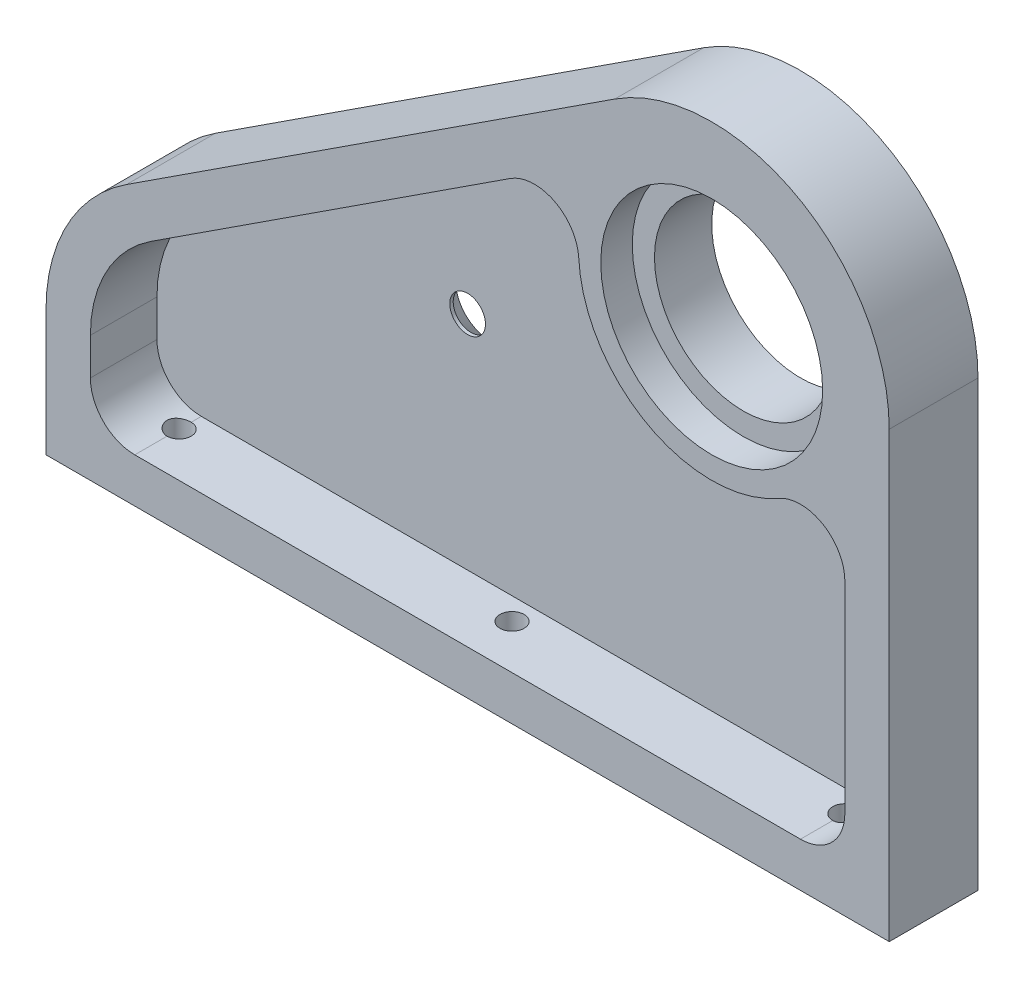
ISO-10303-21;
HEADER;
FILE_DESCRIPTION(('STEP AP214'),'2;1');
FILE_NAME('part.step','',(''),(''),'','','');
FILE_SCHEMA(('AUTOMOTIVE_DESIGN { 1 0 10303 214 1 1 1 1 }'));
ENDSEC;
DATA;
#1=APPLICATION_CONTEXT('core data for automotive mechanical design processes');
#2=APPLICATION_PROTOCOL_DEFINITION('international standard','automotive_design',2000,#1);
#3=PRODUCT_CONTEXT('',#1,'mechanical');
#4=PRODUCT('Part','Part','',(#3));
#5=PRODUCT_RELATED_PRODUCT_CATEGORY('part','',(#4));
#6=PRODUCT_DEFINITION_FORMATION('','',#4);
#7=PRODUCT_DEFINITION_CONTEXT('part definition',#1,'design');
#8=PRODUCT_DEFINITION('design','',#6,#7);
#9=PRODUCT_DEFINITION_SHAPE('','',#8);
#10=(LENGTH_UNIT() NAMED_UNIT(*) SI_UNIT(.MILLI.,.METRE.));
#11=(NAMED_UNIT(*) PLANE_ANGLE_UNIT() SI_UNIT($,.RADIAN.));
#12=(NAMED_UNIT(*) SI_UNIT($,.STERADIAN.) SOLID_ANGLE_UNIT());
#13=UNCERTAINTY_MEASURE_WITH_UNIT(LENGTH_MEASURE(1.E-05),#10,'distance_accuracy_value','');
#14=(GEOMETRIC_REPRESENTATION_CONTEXT(3) GLOBAL_UNCERTAINTY_ASSIGNED_CONTEXT((#13)) GLOBAL_UNIT_ASSIGNED_CONTEXT((#10,
#11,#12)) REPRESENTATION_CONTEXT('',''));
#15=CARTESIAN_POINT('',(0.,0.,0.));
#16=DIRECTION('',(0.,0.,1.));
#17=DIRECTION('',(1.,0.,0.));
#18=AXIS2_PLACEMENT_3D('',#15,#16,#17);
#19=CARTESIAN_POINT('',(0.,0.,6.35));
#20=DIRECTION('',(0.,0.,1.));
#21=DIRECTION('',(1.,0.,0.));
#22=AXIS2_PLACEMENT_3D('',#19,#20,#21);
#23=PLANE('',#22);
#24=CARTESIAN_POINT('',(0.,0.,6.35));
#25=DIRECTION('',(0.,0.,-1.));
#26=DIRECTION('',(1.,0.,0.));
#27=AXIS2_PLACEMENT_3D('',#24,#25,#26);
#28=CIRCLE('',#27,19.05);
#29=CARTESIAN_POINT('',(9.525,-16.4977839420936,6.35));
#30=VERTEX_POINT('',#29);
#31=CARTESIAN_POINT('',(-19.0223209419699,-1.026550525154,6.35));
#32=VERTEX_POINT('',#31);
#33=EDGE_CURVE('E337',#30,#32,#28,.T.);
#34=ORIENTED_EDGE('',*,*,#33,.F.);
#35=CARTESIAN_POINT('',(12.7,-21.9970452561247,6.34999999999999));
#36=DIRECTION('',(0.,0.,1.));
#37=DIRECTION('',(1.,0.,0.));
#38=AXIS2_PLACEMENT_3D('',#35,#36,#37);
#39=CIRCLE('',#38,6.35);
#40=CARTESIAN_POINT('',(19.05,-21.9970452561247,6.35));
#41=VERTEX_POINT('',#40);
#42=EDGE_CURVE('E210',#30,#41,#39,.F.);
#43=ORIENTED_EDGE('',*,*,#42,.T.);
#44=DIRECTION('',(0.,1.,0.));
#45=VECTOR('',#44,1.);
#46=CARTESIAN_POINT('',(19.05,-57.15,6.35));
#47=LINE('',#46,#45);
#48=CARTESIAN_POINT('',(19.05,-50.8,6.35));
#49=VERTEX_POINT('',#48);
#50=EDGE_CURVE('E364',#49,#41,#47,.T.);
#51=ORIENTED_EDGE('',*,*,#50,.F.);
#52=CARTESIAN_POINT('',(12.7,-50.8,6.34999999999999));
#53=DIRECTION('',(0.,0.,1.));
#54=DIRECTION('',(1.,0.,0.));
#55=AXIS2_PLACEMENT_3D('',#52,#53,#54);
#56=CIRCLE('',#55,6.35);
#57=CARTESIAN_POINT('',(12.7,-57.15,6.35));
#58=VERTEX_POINT('',#57);
#59=EDGE_CURVE('E208',#49,#58,#56,.F.);
#60=ORIENTED_EDGE('',*,*,#59,.T.);
#61=DIRECTION('',(1.,0.,0.));
#62=VECTOR('',#61,1.);
#63=CARTESIAN_POINT('',(-88.9,-57.15,6.35));
#64=LINE('',#63,#62);
#65=CARTESIAN_POINT('',(-82.55,-57.15,6.35));
#66=VERTEX_POINT('',#65);
#67=EDGE_CURVE('E362',#66,#58,#64,.T.);
#68=ORIENTED_EDGE('',*,*,#67,.F.);
#69=CARTESIAN_POINT('',(-82.55,-50.8,6.34999999999999));
#70=DIRECTION('',(0.,0.,1.));
#71=DIRECTION('',(1.,0.,0.));
#72=AXIS2_PLACEMENT_3D('',#69,#70,#71);
#73=CIRCLE('',#72,6.35);
#74=CARTESIAN_POINT('',(-88.9,-50.8,6.35));
#75=VERTEX_POINT('',#74);
#76=EDGE_CURVE('E175',#66,#75,#73,.F.);
#77=ORIENTED_EDGE('',*,*,#76,.T.);
#78=DIRECTION('',(0.,-1.,0.));
#79=VECTOR('',#78,1.);
#80=CARTESIAN_POINT('',(-88.9,-45.5155414176721,6.35));
#81=LINE('',#80,#79);
#82=CARTESIAN_POINT('',(-88.9,-45.5155414176721,6.35));
#83=VERTEX_POINT('',#82);
#84=EDGE_CURVE('E359',#83,#75,#81,.T.);
#85=ORIENTED_EDGE('',*,*,#84,.F.);
#86=CARTESIAN_POINT('',(-69.85,-45.5155414176721,6.35));
#87=DIRECTION('',(0.,0.,1.));
#88=DIRECTION('',(1.,0.,0.));
#89=AXIS2_PLACEMENT_3D('',#86,#87,#88);
#90=CIRCLE('',#89,19.05);
#91=CARTESIAN_POINT('',(-80.2501793040366,-29.5550035055625,6.35));
#92=VERTEX_POINT('',#91);
#93=EDGE_CURVE('E356',#92,#83,#90,.T.);
#94=ORIENTED_EDGE('',*,*,#93,.F.);
#95=DIRECTION('',(-0.837823512446701,-0.545941170815567,0.));
#96=VECTOR('',#95,1.);
#97=CARTESIAN_POINT('',(-10.4001793040365,15.9605379121096,6.35));
#98=LINE('',#97,#96);
#99=CARTESIAN_POINT('',(-28.829821023972,3.95144527049789,6.35));
#100=VERTEX_POINT('',#99);
#101=EDGE_CURVE('E354',#100,#92,#98,.T.);
#102=ORIENTED_EDGE('',*,*,#101,.F.);
#103=CARTESIAN_POINT('',(-25.3630945892932,-1.36873403353867,6.34999999999999));
#104=DIRECTION('',(0.,0.,1.));
#105=DIRECTION('',(1.,0.,0.));
#106=AXIS2_PLACEMENT_3D('',#103,#104,#105);
#107=CIRCLE('',#106,6.35);
#108=EDGE_CURVE('E212',#100,#32,#107,.F.);
#109=ORIENTED_EDGE('',*,*,#108,.T.);
#110=EDGE_LOOP('',(#34,#43,#51,#60,#68,#77,#85,#94,#102,#109));
#111=FACE_BOUND('',#110,.T.);
#112=DIRECTION('',(-0.837823512446701,-0.545941170815567,0.));
#113=VECTOR('',#112,1.);
#114=CARTESIAN_POINT('',(-13.8669057387154,21.2807172161462,6.35));
#115=LINE('',#114,#113);
#116=CARTESIAN_POINT('',(-13.8669057387154,21.2807172161462,6.35));
#117=VERTEX_POINT('',#116);
#118=CARTESIAN_POINT('',(-83.7169057387154,-24.2348242015259,6.35));
#119=VERTEX_POINT('',#118);
#120=EDGE_CURVE('E387',#117,#119,#115,.T.);
#121=ORIENTED_EDGE('',*,*,#120,.T.);
#122=CARTESIAN_POINT('',(-69.85,-45.5155414176721,6.35));
#123=DIRECTION('',(0.,0.,1.));
#124=DIRECTION('',(1.,0.,0.));
#125=AXIS2_PLACEMENT_3D('',#122,#123,#124);
#126=CIRCLE('',#125,25.4);
#127=CARTESIAN_POINT('',(-95.25,-45.5155414176721,6.35));
#128=VERTEX_POINT('',#127);
#129=EDGE_CURVE('E427',#119,#128,#126,.T.);
#130=ORIENTED_EDGE('',*,*,#129,.T.);
#131=DIRECTION('',(0.,-1.,0.));
#132=VECTOR('',#131,1.);
#133=CARTESIAN_POINT('',(-95.25,-63.5,6.35));
#134=LINE('',#133,#132);
#135=CARTESIAN_POINT('',(-95.25,-63.5,6.35));
#136=VERTEX_POINT('',#135);
#137=EDGE_CURVE('E391',#128,#136,#134,.T.);
#138=ORIENTED_EDGE('',*,*,#137,.T.);
#139=DIRECTION('',(1.,0.,0.));
#140=VECTOR('',#139,1.);
#141=CARTESIAN_POINT('',(25.4,-63.5,6.35));
#142=LINE('',#141,#140);
#143=CARTESIAN_POINT('',(25.4,-63.5,6.35));
#144=VERTEX_POINT('',#143);
#145=EDGE_CURVE('E393',#136,#144,#142,.T.);
#146=ORIENTED_EDGE('',*,*,#145,.T.);
#147=DIRECTION('',(0.,1.,0.));
#148=VECTOR('',#147,1.);
#149=CARTESIAN_POINT('',(25.4,0.,6.35));
#150=LINE('',#149,#148);
#151=CARTESIAN_POINT('',(25.4,0.,6.35));
#152=VERTEX_POINT('',#151);
#153=EDGE_CURVE('E395',#144,#152,#150,.T.);
#154=ORIENTED_EDGE('',*,*,#153,.T.);
#155=CARTESIAN_POINT('',(0.,0.,6.35));
#156=DIRECTION('',(0.,0.,1.));
#157=DIRECTION('',(1.,0.,0.));
#158=AXIS2_PLACEMENT_3D('',#155,#156,#157);
#159=CIRCLE('',#158,25.4);
#160=EDGE_CURVE('E384',#152,#117,#159,.T.);
#161=ORIENTED_EDGE('',*,*,#160,.T.);
#162=EDGE_LOOP('',(#121,#130,#138,#146,#154,#161));
#163=FACE_BOUND('',#162,.T.);
#164=CARTESIAN_POINT('',(0.,0.,6.35));
#165=DIRECTION('',(0.,0.,-1.));
#166=DIRECTION('',(-1.,0.,0.));
#167=AXIS2_PLACEMENT_3D('',#164,#165,#166);
#168=CIRCLE('',#167,15.875);
#169=CARTESIAN_POINT('',(-15.875,0.,6.35));
#170=VERTEX_POINT('',#169);
#171=EDGE_CURVE('E373',#170,#170,#168,.T.);
#172=ORIENTED_EDGE('',*,*,#171,.T.);
#173=EDGE_LOOP('',(#172));
#174=FACE_BOUND('',#173,.T.);
#175=ADVANCED_FACE('F36',(#111,#163,#174),#23,.T.);
#176=CARTESIAN_POINT('',(0.,0.,6.35));
#177=DIRECTION('',(0.,0.,-1.));
#178=DIRECTION('',(-1.,0.,0.));
#179=AXIS2_PLACEMENT_3D('',#176,#177,#178);
#180=CYLINDRICAL_SURFACE('',#179,25.4);
#181=CARTESIAN_POINT('',(0.,0.,-6.35));
#182=DIRECTION('',(0.,0.,1.));
#183=DIRECTION('',(1.,0.,0.));
#184=AXIS2_PLACEMENT_3D('',#181,#182,#183);
#185=CIRCLE('',#184,25.4);
#186=CARTESIAN_POINT('',(25.4,0.,-6.35));
#187=VERTEX_POINT('',#186);
#188=CARTESIAN_POINT('',(-13.8669057387154,21.2807172161462,-6.35));
#189=VERTEX_POINT('',#188);
#190=EDGE_CURVE('E383',#187,#189,#185,.T.);
#191=ORIENTED_EDGE('',*,*,#190,.T.);
#192=DIRECTION('',(0.,0.,-1.));
#193=VECTOR('',#192,1.);
#194=CARTESIAN_POINT('',(-13.8669057387154,21.2807172161462,6.35));
#195=LINE('',#194,#193);
#196=EDGE_CURVE('E416',#117,#189,#195,.T.);
#197=ORIENTED_EDGE('',*,*,#196,.F.);
#198=ORIENTED_EDGE('',*,*,#160,.F.);
#199=DIRECTION('',(0.,0.,-1.));
#200=VECTOR('',#199,1.);
#201=CARTESIAN_POINT('',(25.4,0.,6.35));
#202=LINE('',#201,#200);
#203=EDGE_CURVE('E397',#152,#187,#202,.T.);
#204=ORIENTED_EDGE('',*,*,#203,.T.);
#205=EDGE_LOOP('',(#191,#197,#198,#204));
#206=FACE_BOUND('',#205,.T.);
#207=ADVANCED_FACE('F275',(#206),#180,.T.);
#208=CARTESIAN_POINT('',(-13.8669057387154,21.2807172161462,6.35));
#209=DIRECTION('',(0.545941170815567,-0.837823512446701,0.));
#210=DIRECTION('',(0.837823512446701,0.545941170815567,0.));
#211=AXIS2_PLACEMENT_3D('',#208,#209,#210);
#212=PLANE('',#211);
#213=DIRECTION('',(-0.837823512446701,-0.545941170815567,0.));
#214=VECTOR('',#213,1.);
#215=CARTESIAN_POINT('',(-13.8669057387154,21.2807172161462,-6.35));
#216=LINE('',#215,#214);
#217=CARTESIAN_POINT('',(-83.7169057387154,-24.2348242015259,-6.35));
#218=VERTEX_POINT('',#217);
#219=EDGE_CURVE('E400',#189,#218,#216,.T.);
#220=ORIENTED_EDGE('',*,*,#219,.T.);
#221=DIRECTION('',(0.,0.,-1.));
#222=VECTOR('',#221,1.);
#223=CARTESIAN_POINT('',(-83.7169057387154,-24.2348242015259,6.35));
#224=LINE('',#223,#222);
#225=EDGE_CURVE('E426',#218,#119,#224,.F.);
#226=ORIENTED_EDGE('',*,*,#225,.T.);
#227=ORIENTED_EDGE('',*,*,#120,.F.);
#228=ORIENTED_EDGE('',*,*,#196,.T.);
#229=EDGE_LOOP('',(#220,#226,#227,#228));
#230=FACE_BOUND('',#229,.T.);
#231=ADVANCED_FACE('F291',(#230),#212,.F.);
#232=CARTESIAN_POINT('',(-95.25,-63.5,6.35));
#233=DIRECTION('',(1.,0.,0.));
#234=DIRECTION('',(0.,1.,0.));
#235=AXIS2_PLACEMENT_3D('',#232,#233,#234);
#236=PLANE('',#235);
#237=ORIENTED_EDGE('',*,*,#137,.F.);
#238=DIRECTION('',(0.,0.,-1.));
#239=VECTOR('',#238,1.);
#240=CARTESIAN_POINT('',(-95.25,-45.5155414176721,6.35));
#241=LINE('',#240,#239);
#242=CARTESIAN_POINT('',(-95.25,-45.5155414176721,-6.35));
#243=VERTEX_POINT('',#242);
#244=EDGE_CURVE('E419',#128,#243,#241,.T.);
#245=ORIENTED_EDGE('',*,*,#244,.T.);
#246=DIRECTION('',(0.,-1.,0.));
#247=VECTOR('',#246,1.);
#248=CARTESIAN_POINT('',(-95.25,-63.5,-6.35));
#249=LINE('',#248,#247);
#250=CARTESIAN_POINT('',(-95.25,-63.5,-6.35));
#251=VERTEX_POINT('',#250);
#252=EDGE_CURVE('E403',#243,#251,#249,.T.);
#253=ORIENTED_EDGE('',*,*,#252,.T.);
#254=DIRECTION('',(0.,0.,-1.));
#255=VECTOR('',#254,1.);
#256=CARTESIAN_POINT('',(-95.25,-63.5,6.35));
#257=LINE('',#256,#255);
#258=EDGE_CURVE('E413',#136,#251,#257,.T.);
#259=ORIENTED_EDGE('',*,*,#258,.F.);
#260=EDGE_LOOP('',(#237,#245,#253,#259));
#261=FACE_BOUND('',#260,.T.);
#262=ADVANCED_FACE('F287',(#261),#236,.F.);
#263=CARTESIAN_POINT('',(25.4,-63.5,6.35));
#264=DIRECTION('',(0.,1.,0.));
#265=DIRECTION('',(0.,0.,1.));
#266=AXIS2_PLACEMENT_3D('',#263,#264,#265);
#267=PLANE('',#266);
#268=CARTESIAN_POINT('',(-82.55,-63.5,0.));
#269=DIRECTION('',(0.,-1.,0.));
#270=DIRECTION('',(0.,0.,-1.));
#271=AXIS2_PLACEMENT_3D('',#268,#269,#270);
#272=CIRCLE('',#271,1.7272);
#273=CARTESIAN_POINT('',(-82.55,-63.5,-1.72720000000001));
#274=VERTEX_POINT('',#273);
#275=EDGE_CURVE('E171',#274,#274,#272,.T.);
#276=ORIENTED_EDGE('',*,*,#275,.F.);
#277=EDGE_LOOP('',(#276));
#278=FACE_BOUND('',#277,.T.);
#279=CARTESIAN_POINT('',(-34.925,-63.5,0.));
#280=DIRECTION('',(0.,-1.,0.));
#281=DIRECTION('',(0.,0.,-1.));
#282=AXIS2_PLACEMENT_3D('',#279,#280,#281);
#283=CIRCLE('',#282,1.7272);
#284=CARTESIAN_POINT('',(-34.925,-63.5,-1.7272));
#285=VERTEX_POINT('',#284);
#286=EDGE_CURVE('E170',#285,#285,#283,.T.);
#287=ORIENTED_EDGE('',*,*,#286,.F.);
#288=EDGE_LOOP('',(#287));
#289=FACE_BOUND('',#288,.T.);
#290=CARTESIAN_POINT('',(12.7,-63.5,0.));
#291=DIRECTION('',(0.,-1.,0.));
#292=DIRECTION('',(0.,0.,-1.));
#293=AXIS2_PLACEMENT_3D('',#290,#291,#292);
#294=CIRCLE('',#293,1.7272);
#295=CARTESIAN_POINT('',(12.7,-63.5,-1.7272));
#296=VERTEX_POINT('',#295);
#297=EDGE_CURVE('E333',#296,#296,#294,.T.);
#298=ORIENTED_EDGE('',*,*,#297,.F.);
#299=EDGE_LOOP('',(#298));
#300=FACE_BOUND('',#299,.T.);
#301=DIRECTION('',(1.,0.,0.));
#302=VECTOR('',#301,1.);
#303=CARTESIAN_POINT('',(25.4,-63.5,-6.35));
#304=LINE('',#303,#302);
#305=CARTESIAN_POINT('',(25.4,-63.5,-6.35));
#306=VERTEX_POINT('',#305);
#307=EDGE_CURVE('E405',#251,#306,#304,.T.);
#308=ORIENTED_EDGE('',*,*,#307,.T.);
#309=DIRECTION('',(0.,0.,-1.));
#310=VECTOR('',#309,1.);
#311=CARTESIAN_POINT('',(25.4,-63.5,6.35));
#312=LINE('',#311,#310);
#313=EDGE_CURVE('E410',#144,#306,#312,.T.);
#314=ORIENTED_EDGE('',*,*,#313,.F.);
#315=ORIENTED_EDGE('',*,*,#145,.F.);
#316=ORIENTED_EDGE('',*,*,#258,.T.);
#317=EDGE_LOOP('',(#308,#314,#315,#316));
#318=FACE_BOUND('',#317,.T.);
#319=ADVANCED_FACE('F283',(#278,#289,#300,#318),#267,.F.);
#320=CARTESIAN_POINT('',(25.4,0.,6.35));
#321=DIRECTION('',(-1.,0.,0.));
#322=DIRECTION('',(0.,-1.,0.));
#323=AXIS2_PLACEMENT_3D('',#320,#321,#322);
#324=PLANE('',#323);
#325=DIRECTION('',(0.,1.,0.));
#326=VECTOR('',#325,1.);
#327=CARTESIAN_POINT('',(25.4,0.,-6.35));
#328=LINE('',#327,#326);
#329=EDGE_CURVE('E388',#306,#187,#328,.T.);
#330=ORIENTED_EDGE('',*,*,#329,.T.);
#331=ORIENTED_EDGE('',*,*,#203,.F.);
#332=ORIENTED_EDGE('',*,*,#153,.F.);
#333=ORIENTED_EDGE('',*,*,#313,.T.);
#334=EDGE_LOOP('',(#330,#331,#332,#333));
#335=FACE_BOUND('',#334,.T.);
#336=ADVANCED_FACE('F279',(#335),#324,.F.);
#337=CARTESIAN_POINT('',(0.,0.,-6.35));
#338=DIRECTION('',(0.,0.,1.));
#339=DIRECTION('',(1.,0.,0.));
#340=AXIS2_PLACEMENT_3D('',#337,#338,#339);
#341=PLANE('',#340);
#342=CARTESIAN_POINT('',(-44.45,-25.4,-6.35));
#343=DIRECTION('',(0.,0.,-1.));
#344=DIRECTION('',(-1.,0.,0.));
#345=AXIS2_PLACEMENT_3D('',#342,#343,#344);
#346=CIRCLE('',#345,4.8895);
#347=CARTESIAN_POINT('',(-49.3395,-25.4,-6.35));
#348=VERTEX_POINT('',#347);
#349=EDGE_CURVE('E325',#348,#348,#346,.T.);
#350=ORIENTED_EDGE('',*,*,#349,.F.);
#351=EDGE_LOOP('',(#350));
#352=FACE_BOUND('',#351,.T.);
#353=CARTESIAN_POINT('',(0.,0.,-6.35));
#354=DIRECTION('',(0.,0.,1.));
#355=DIRECTION('',(1.,0.,0.));
#356=AXIS2_PLACEMENT_3D('',#353,#354,#355);
#357=CIRCLE('',#356,12.7);
#358=CARTESIAN_POINT('',(12.7,0.,-6.35));
#359=VERTEX_POINT('',#358);
#360=EDGE_CURVE('E380',#359,#359,#357,.T.);
#361=ORIENTED_EDGE('',*,*,#360,.T.);
#362=EDGE_LOOP('',(#361));
#363=FACE_BOUND('',#362,.T.);
#364=ORIENTED_EDGE('',*,*,#252,.F.);
#365=CARTESIAN_POINT('',(-69.85,-45.5155414176721,-6.35));
#366=DIRECTION('',(0.,0.,1.));
#367=DIRECTION('',(1.,0.,0.));
#368=AXIS2_PLACEMENT_3D('',#365,#366,#367);
#369=CIRCLE('',#368,25.4);
#370=EDGE_CURVE('E424',#243,#218,#369,.F.);
#371=ORIENTED_EDGE('',*,*,#370,.T.);
#372=ORIENTED_EDGE('',*,*,#219,.F.);
#373=ORIENTED_EDGE('',*,*,#190,.F.);
#374=ORIENTED_EDGE('',*,*,#329,.F.);
#375=ORIENTED_EDGE('',*,*,#307,.F.);
#376=EDGE_LOOP('',(#364,#371,#372,#373,#374,#375));
#377=FACE_BOUND('',#376,.T.);
#378=ADVANCED_FACE('F271',(#352,#363,#377),#341,.F.);
#379=CARTESIAN_POINT('',(0.,0.,-6.35));
#380=DIRECTION('',(0.,0.,1.));
#381=DIRECTION('',(1.,0.,0.));
#382=AXIS2_PLACEMENT_3D('',#379,#380,#381);
#383=CYLINDRICAL_SURFACE('',#382,12.7);
#384=CARTESIAN_POINT('',(0.,0.,1.8415));
#385=DIRECTION('',(0.,0.,-1.));
#386=DIRECTION('',(-1.,0.,0.));
#387=AXIS2_PLACEMENT_3D('',#384,#385,#386);
#388=CIRCLE('',#387,12.7);
#389=CARTESIAN_POINT('',(-12.7,0.,1.8415));
#390=VERTEX_POINT('',#389);
#391=EDGE_CURVE('E377',#390,#390,#388,.F.);
#392=ORIENTED_EDGE('',*,*,#391,.T.);
#393=EDGE_LOOP('',(#392));
#394=FACE_BOUND('',#393,.T.);
#395=ORIENTED_EDGE('',*,*,#360,.F.);
#396=EDGE_LOOP('',(#395));
#397=FACE_BOUND('',#396,.T.);
#398=ADVANCED_FACE('F264',(#394,#397),#383,.F.);
#399=CARTESIAN_POINT('',(0.,0.,1.8415));
#400=DIRECTION('',(0.,0.,-1.));
#401=DIRECTION('',(-1.,0.,0.));
#402=AXIS2_PLACEMENT_3D('',#399,#400,#401);
#403=PLANE('',#402);
#404=CARTESIAN_POINT('',(0.,0.,1.8415));
#405=DIRECTION('',(0.,0.,-1.));
#406=DIRECTION('',(-1.,0.,0.));
#407=AXIS2_PLACEMENT_3D('',#404,#405,#406);
#408=CIRCLE('',#407,15.875);
#409=CARTESIAN_POINT('',(-15.875,0.,1.8415));
#410=VERTEX_POINT('',#409);
#411=EDGE_CURVE('E374',#410,#410,#408,.T.);
#412=ORIENTED_EDGE('',*,*,#411,.F.);
#413=EDGE_LOOP('',(#412));
#414=FACE_BOUND('',#413,.T.);
#415=ORIENTED_EDGE('',*,*,#391,.F.);
#416=EDGE_LOOP('',(#415));
#417=FACE_BOUND('',#416,.T.);
#418=ADVANCED_FACE('F260',(#414,#417),#403,.F.);
#419=CARTESIAN_POINT('',(0.,0.,1.8415));
#420=DIRECTION('',(0.,0.,1.));
#421=DIRECTION('',(1.,0.,0.));
#422=AXIS2_PLACEMENT_3D('',#419,#420,#421);
#423=CYLINDRICAL_SURFACE('',#422,15.875);
#424=ORIENTED_EDGE('',*,*,#411,.T.);
#425=EDGE_LOOP('',(#424));
#426=FACE_BOUND('',#425,.T.);
#427=ORIENTED_EDGE('',*,*,#171,.F.);
#428=EDGE_LOOP('',(#427));
#429=FACE_BOUND('',#428,.T.);
#430=ADVANCED_FACE('F263',(#426,#429),#423,.F.);
#431=CARTESIAN_POINT('',(-69.85,-45.5155414176721,6.35));
#432=DIRECTION('',(0.,0.,-1.));
#433=DIRECTION('',(-1.,0.,0.));
#434=AXIS2_PLACEMENT_3D('',#431,#432,#433);
#435=CYLINDRICAL_SURFACE('',#434,25.4);
#436=ORIENTED_EDGE('',*,*,#129,.F.);
#437=ORIENTED_EDGE('',*,*,#225,.F.);
#438=ORIENTED_EDGE('',*,*,#370,.F.);
#439=ORIENTED_EDGE('',*,*,#244,.F.);
#440=EDGE_LOOP('',(#436,#437,#438,#439));
#441=FACE_BOUND('',#440,.T.);
#442=ADVANCED_FACE('F258',(#441),#435,.T.);
#443=CARTESIAN_POINT('',(0.,0.,-136.727732967704));
#444=DIRECTION('',(0.,0.,1.));
#445=DIRECTION('',(1.,0.,0.));
#446=AXIS2_PLACEMENT_3D('',#443,#444,#445);
#447=CYLINDRICAL_SURFACE('',#446,19.05);
#448=CARTESIAN_POINT('',(0.,0.,-3.17500000000001));
#449=DIRECTION('',(0.,0.,1.));
#450=DIRECTION('',(1.,0.,0.));
#451=AXIS2_PLACEMENT_3D('',#448,#449,#450);
#452=CIRCLE('',#451,19.05);
#453=CARTESIAN_POINT('',(-19.0223209419699,-1.026550525154,-3.17500000000001));
#454=VERTEX_POINT('',#453);
#455=CARTESIAN_POINT('',(9.525,-16.4977839420936,-3.17500000000001));
#456=VERTEX_POINT('',#455);
#457=EDGE_CURVE('E348',#454,#456,#452,.T.);
#458=ORIENTED_EDGE('',*,*,#457,.T.);
#459=DIRECTION('',(0.,0.,1.));
#460=VECTOR('',#459,1.);
#461=CARTESIAN_POINT('',(9.525,-16.4977839420936,-136.727732967704));
#462=LINE('',#461,#460);
#463=EDGE_CURVE('E201',#456,#30,#462,.T.);
#464=ORIENTED_EDGE('',*,*,#463,.T.);
#465=ORIENTED_EDGE('',*,*,#33,.T.);
#466=DIRECTION('',(0.,0.,1.));
#467=VECTOR('',#466,1.);
#468=CARTESIAN_POINT('',(-19.0223209419699,-1.026550525154,-136.727732967704));
#469=LINE('',#468,#467);
#470=EDGE_CURVE('E199',#32,#454,#469,.F.);
#471=ORIENTED_EDGE('',*,*,#470,.T.);
#472=EDGE_LOOP('',(#458,#464,#465,#471));
#473=FACE_BOUND('',#472,.T.);
#474=ADVANCED_FACE('F240',(#473),#447,.T.);
#475=CARTESIAN_POINT('',(19.05,-57.15,-136.727732967704));
#476=DIRECTION('',(1.,0.,0.));
#477=DIRECTION('',(0.,0.,-1.));
#478=AXIS2_PLACEMENT_3D('',#475,#476,#477);
#479=PLANE('',#478);
#480=DIRECTION('',(0.,-1.,0.));
#481=VECTOR('',#480,1.);
#482=CARTESIAN_POINT('',(19.05,-57.15,-3.17500000000001));
#483=LINE('',#482,#481);
#484=CARTESIAN_POINT('',(19.05,-21.9970452561247,-3.17500000000001));
#485=VERTEX_POINT('',#484);
#486=CARTESIAN_POINT('',(19.05,-50.8,-3.17500000000001));
#487=VERTEX_POINT('',#486);
#488=EDGE_CURVE('E345',#485,#487,#483,.T.);
#489=ORIENTED_EDGE('',*,*,#488,.T.);
#490=DIRECTION('',(0.,0.,1.));
#491=VECTOR('',#490,1.);
#492=CARTESIAN_POINT('',(19.05,-50.8,6.34999999999999));
#493=LINE('',#492,#491);
#494=EDGE_CURVE('E196',#487,#49,#493,.T.);
#495=ORIENTED_EDGE('',*,*,#494,.T.);
#496=ORIENTED_EDGE('',*,*,#50,.T.);
#497=DIRECTION('',(0.,0.,-1.));
#498=VECTOR('',#497,1.);
#499=CARTESIAN_POINT('',(19.05,-21.9970452561247,-3.17500000000001));
#500=LINE('',#499,#498);
#501=EDGE_CURVE('E194',#41,#485,#500,.T.);
#502=ORIENTED_EDGE('',*,*,#501,.T.);
#503=EDGE_LOOP('',(#489,#495,#496,#502));
#504=FACE_BOUND('',#503,.T.);
#505=ADVANCED_FACE('F237',(#504),#479,.F.);
#506=CARTESIAN_POINT('',(-88.9,-57.15,-136.727732967704));
#507=DIRECTION('',(0.,-1.,0.));
#508=DIRECTION('',(0.,0.,-1.));
#509=AXIS2_PLACEMENT_3D('',#506,#507,#508);
#510=PLANE('',#509);
#511=CARTESIAN_POINT('',(-34.925,-57.15,0.));
#512=DIRECTION('',(0.,-1.,0.));
#513=DIRECTION('',(0.,0.,-1.));
#514=AXIS2_PLACEMENT_3D('',#511,#512,#513);
#515=CIRCLE('',#514,1.7272);
#516=CARTESIAN_POINT('',(-34.925,-57.15,-1.7272));
#517=VERTEX_POINT('',#516);
#518=EDGE_CURVE('E220',#517,#517,#515,.T.);
#519=ORIENTED_EDGE('',*,*,#518,.T.);
#520=EDGE_LOOP('',(#519));
#521=FACE_BOUND('',#520,.T.);
#522=DIRECTION('',(0.,0.,1.));
#523=VECTOR('',#522,1.);
#524=CARTESIAN_POINT('',(-82.55,-57.15,6.34999999999999));
#525=LINE('',#524,#523);
#526=CARTESIAN_POINT('',(-82.55,-57.15,-3.17500000000001));
#527=VERTEX_POINT('',#526);
#528=CARTESIAN_POINT('',(-82.55,-57.15,-1.72720000000001));
#529=VERTEX_POINT('',#528);
#530=EDGE_CURVE('E169',#527,#529,#525,.T.);
#531=ORIENTED_EDGE('',*,*,#530,.T.);
#532=CARTESIAN_POINT('',(-82.55,-57.15,0.));
#533=DIRECTION('',(0.,-1.,0.));
#534=DIRECTION('',(0.,0.,-1.));
#535=AXIS2_PLACEMENT_3D('',#532,#533,#534);
#536=CIRCLE('',#535,1.7272);
#537=CARTESIAN_POINT('',(-82.55,-57.15,1.7272));
#538=VERTEX_POINT('',#537);
#539=EDGE_CURVE('E51',#529,#538,#536,.T.);
#540=ORIENTED_EDGE('',*,*,#539,.T.);
#541=EDGE_CURVE('E166',#538,#66,#525,.T.);
#542=ORIENTED_EDGE('',*,*,#541,.T.);
#543=ORIENTED_EDGE('',*,*,#67,.T.);
#544=DIRECTION('',(0.,0.,1.));
#545=VECTOR('',#544,1.);
#546=CARTESIAN_POINT('',(12.7,-57.15,-3.17500000000001));
#547=LINE('',#546,#545);
#548=CARTESIAN_POINT('',(12.7,-57.15,1.7272));
#549=VERTEX_POINT('',#548);
#550=EDGE_CURVE('E177',#58,#549,#547,.F.);
#551=ORIENTED_EDGE('',*,*,#550,.T.);
#552=CARTESIAN_POINT('',(12.7,-57.15,0.));
#553=DIRECTION('',(0.,-1.,0.));
#554=DIRECTION('',(0.,0.,-1.));
#555=AXIS2_PLACEMENT_3D('',#552,#553,#554);
#556=CIRCLE('',#555,1.7272);
#557=CARTESIAN_POINT('',(12.7,-57.15,-1.7272));
#558=VERTEX_POINT('',#557);
#559=EDGE_CURVE('E57',#549,#558,#556,.T.);
#560=ORIENTED_EDGE('',*,*,#559,.T.);
#561=CARTESIAN_POINT('',(12.7,-57.15,-3.17500000000001));
#562=VERTEX_POINT('',#561);
#563=EDGE_CURVE('E181',#558,#562,#547,.F.);
#564=ORIENTED_EDGE('',*,*,#563,.T.);
#565=DIRECTION('',(-1.,0.,0.));
#566=VECTOR('',#565,1.);
#567=CARTESIAN_POINT('',(-88.9,-57.15,-3.17500000000001));
#568=LINE('',#567,#566);
#569=EDGE_CURVE('E343',#562,#527,#568,.T.);
#570=ORIENTED_EDGE('',*,*,#569,.T.);
#571=EDGE_LOOP('',(#531,#540,#542,#543,#551,#560,#564,#570));
#572=FACE_BOUND('',#571,.T.);
#573=ADVANCED_FACE('F164',(#521,#572),#510,.F.);
#574=CARTESIAN_POINT('',(-88.9,-45.5155414176721,-136.727732967704));
#575=DIRECTION('',(-1.,0.,0.));
#576=DIRECTION('',(0.,0.,1.));
#577=AXIS2_PLACEMENT_3D('',#574,#575,#576);
#578=PLANE('',#577);
#579=ORIENTED_EDGE('',*,*,#84,.T.);
#580=DIRECTION('',(0.,0.,1.));
#581=VECTOR('',#580,1.);
#582=CARTESIAN_POINT('',(-88.9,-50.8,-3.17500000000001));
#583=LINE('',#582,#581);
#584=CARTESIAN_POINT('',(-88.9,-50.8,-3.17500000000001));
#585=VERTEX_POINT('',#584);
#586=EDGE_CURVE('E179',#75,#585,#583,.F.);
#587=ORIENTED_EDGE('',*,*,#586,.T.);
#588=DIRECTION('',(0.,1.,0.));
#589=VECTOR('',#588,1.);
#590=CARTESIAN_POINT('',(-88.9,-45.5155414176721,-3.17500000000001));
#591=LINE('',#590,#589);
#592=CARTESIAN_POINT('',(-88.9,-45.5155414176721,-3.17500000000001));
#593=VERTEX_POINT('',#592);
#594=EDGE_CURVE('E340',#585,#593,#591,.T.);
#595=ORIENTED_EDGE('',*,*,#594,.T.);
#596=DIRECTION('',(0.,0.,1.));
#597=VECTOR('',#596,1.);
#598=CARTESIAN_POINT('',(-88.9,-45.5155414176721,-136.727732967704));
#599=LINE('',#598,#597);
#600=EDGE_CURVE('E341',#593,#83,#599,.T.);
#601=ORIENTED_EDGE('',*,*,#600,.T.);
#602=EDGE_LOOP('',(#579,#587,#595,#601));
#603=FACE_BOUND('',#602,.T.);
#604=ADVANCED_FACE('F244',(#603),#578,.F.);
#605=CARTESIAN_POINT('',(-69.85,-45.5155414176721,-136.727732967704));
#606=DIRECTION('',(0.,0.,1.));
#607=DIRECTION('',(1.,0.,0.));
#608=AXIS2_PLACEMENT_3D('',#605,#606,#607);
#609=CYLINDRICAL_SURFACE('',#608,19.05);
#610=CARTESIAN_POINT('',(-69.85,-45.5155414176721,-3.17500000000001));
#611=DIRECTION('',(0.,0.,1.));
#612=DIRECTION('',(1.,0.,0.));
#613=AXIS2_PLACEMENT_3D('',#610,#611,#612);
#614=CIRCLE('',#613,19.05);
#615=CARTESIAN_POINT('',(-80.2501793040366,-29.5550035055625,-3.17500000000001));
#616=VERTEX_POINT('',#615);
#617=EDGE_CURVE('E338',#593,#616,#614,.F.);
#618=ORIENTED_EDGE('',*,*,#617,.T.);
#619=DIRECTION('',(0.,0.,1.));
#620=VECTOR('',#619,1.);
#621=CARTESIAN_POINT('',(-80.2501793040366,-29.5550035055625,-136.727732967704));
#622=LINE('',#621,#620);
#623=EDGE_CURVE('E367',#616,#92,#622,.T.);
#624=ORIENTED_EDGE('',*,*,#623,.T.);
#625=ORIENTED_EDGE('',*,*,#93,.T.);
#626=ORIENTED_EDGE('',*,*,#600,.F.);
#627=EDGE_LOOP('',(#618,#624,#625,#626));
#628=FACE_BOUND('',#627,.T.);
#629=ADVANCED_FACE('F248',(#628),#609,.F.);
#630=CARTESIAN_POINT('',(-10.4001793040365,15.9605379121096,-136.727732967704));
#631=DIRECTION('',(-0.545941170815567,0.837823512446701,0.));
#632=DIRECTION('',(-0.837823512446701,-0.545941170815567,0.));
#633=AXIS2_PLACEMENT_3D('',#630,#631,#632);
#634=PLANE('',#633);
#635=DIRECTION('',(0.837823512446701,0.545941170815567,0.));
#636=VECTOR('',#635,1.);
#637=CARTESIAN_POINT('',(-10.4001793040365,15.9605379121096,-3.17500000000001));
#638=LINE('',#637,#636);
#639=CARTESIAN_POINT('',(-28.829821023972,3.95144527049789,-3.17500000000001));
#640=VERTEX_POINT('',#639);
#641=EDGE_CURVE('E351',#616,#640,#638,.T.);
#642=ORIENTED_EDGE('',*,*,#641,.T.);
#643=DIRECTION('',(0.,0.,-1.));
#644=VECTOR('',#643,1.);
#645=CARTESIAN_POINT('',(-28.829821023972,3.95144527049789,6.34999999999999));
#646=LINE('',#645,#644);
#647=EDGE_CURVE('E204',#640,#100,#646,.F.);
#648=ORIENTED_EDGE('',*,*,#647,.T.);
#649=ORIENTED_EDGE('',*,*,#101,.T.);
#650=ORIENTED_EDGE('',*,*,#623,.F.);
#651=EDGE_LOOP('',(#642,#648,#649,#650));
#652=FACE_BOUND('',#651,.T.);
#653=ADVANCED_FACE('F235',(#652),#634,.F.);
#654=CARTESIAN_POINT('',(0.,0.,-3.175));
#655=DIRECTION('',(0.,0.,1.));
#656=DIRECTION('',(1.,0.,0.));
#657=AXIS2_PLACEMENT_3D('',#654,#655,#656);
#658=PLANE('',#657);
#659=CARTESIAN_POINT('',(-44.45,-25.4,-3.175));
#660=DIRECTION('',(0.,0.,1.));
#661=DIRECTION('',(1.,0.,0.));
#662=AXIS2_PLACEMENT_3D('',#659,#660,#661);
#663=CIRCLE('',#662,2.55269999999999);
#664=CARTESIAN_POINT('',(-41.8973,-25.4,-3.175));
#665=VERTEX_POINT('',#664);
#666=EDGE_CURVE('E40',#665,#665,#663,.T.);
#667=ORIENTED_EDGE('',*,*,#666,.F.);
#668=EDGE_LOOP('',(#667));
#669=FACE_BOUND('',#668,.T.);
#670=ORIENTED_EDGE('',*,*,#594,.F.);
#671=CARTESIAN_POINT('',(-82.55,-50.8,-3.17500000000001));
#672=DIRECTION('',(0.,0.,1.));
#673=DIRECTION('',(1.,0.,0.));
#674=AXIS2_PLACEMENT_3D('',#671,#672,#673);
#675=CIRCLE('',#674,6.35);
#676=EDGE_CURVE('E192',#585,#527,#675,.T.);
#677=ORIENTED_EDGE('',*,*,#676,.T.);
#678=ORIENTED_EDGE('',*,*,#569,.F.);
#679=CARTESIAN_POINT('',(12.7,-50.8,-3.17500000000001));
#680=DIRECTION('',(0.,0.,1.));
#681=DIRECTION('',(1.,0.,0.));
#682=AXIS2_PLACEMENT_3D('',#679,#680,#681);
#683=CIRCLE('',#682,6.35);
#684=EDGE_CURVE('E190',#562,#487,#683,.T.);
#685=ORIENTED_EDGE('',*,*,#684,.T.);
#686=ORIENTED_EDGE('',*,*,#488,.F.);
#687=CARTESIAN_POINT('',(12.7,-21.9970452561247,-3.17500000000001));
#688=DIRECTION('',(0.,0.,1.));
#689=DIRECTION('',(1.,0.,0.));
#690=AXIS2_PLACEMENT_3D('',#687,#688,#689);
#691=CIRCLE('',#690,6.35);
#692=EDGE_CURVE('E188',#485,#456,#691,.T.);
#693=ORIENTED_EDGE('',*,*,#692,.T.);
#694=ORIENTED_EDGE('',*,*,#457,.F.);
#695=CARTESIAN_POINT('',(-25.3630945892932,-1.36873403353867,-3.17500000000001));
#696=DIRECTION('',(0.,0.,1.));
#697=DIRECTION('',(1.,0.,0.));
#698=AXIS2_PLACEMENT_3D('',#695,#696,#697);
#699=CIRCLE('',#698,6.35);
#700=EDGE_CURVE('E186',#454,#640,#699,.T.);
#701=ORIENTED_EDGE('',*,*,#700,.T.);
#702=ORIENTED_EDGE('',*,*,#641,.F.);
#703=ORIENTED_EDGE('',*,*,#617,.F.);
#704=EDGE_LOOP('',(#670,#677,#678,#685,#686,#693,#694,#701,#702,#703));
#705=FACE_BOUND('',#704,.T.);
#706=ADVANCED_FACE('F232',(#669,#705),#658,.T.);
#707=CARTESIAN_POINT('',(-82.55,-50.8,-136.727732967704));
#708=DIRECTION('',(0.,0.,-1.));
#709=DIRECTION('',(-1.,0.,0.));
#710=AXIS2_PLACEMENT_3D('',#707,#708,#709);
#711=CYLINDRICAL_SURFACE('',#710,6.35);
#712=ORIENTED_EDGE('',*,*,#541,.F.);
#713=CARTESIAN_POINT('',(-82.55,-57.15,1.7272));
#714=CARTESIAN_POINT('',(-82.5976614132646,-57.1500029366136,1.72720066140031));
#715=CARTESIAN_POINT('',(-82.6452991784275,-57.1494627470408,1.72522593627663));
#716=CARTESIAN_POINT('',(-82.7402175459027,-57.1473274064605,1.71735442729235));
#717=CARTESIAN_POINT('',(-82.7874982088207,-57.1457324387281,1.71145832479749));
#718=CARTESIAN_POINT('',(-82.9280844918299,-57.1394245760464,1.68797679126051));
#719=CARTESIAN_POINT('',(-83.0204224722108,-57.1331883485816,1.66459773014344));
#720=CARTESIAN_POINT('',(-83.1996853681021,-57.1173198791514,1.60315957150047));
#721=CARTESIAN_POINT('',(-83.2866109385884,-57.107688049044,1.56510225427027));
#722=CARTESIAN_POINT('',(-83.4528796286603,-57.086043356671,1.47544868927492));
#723=CARTESIAN_POINT('',(-83.532220459275,-57.0740297789677,1.42384837190348));
#724=CARTESIAN_POINT('',(-83.6829230698435,-57.0485965786257,1.30727802315844));
#725=CARTESIAN_POINT('',(-83.7540769568527,-57.0351523052332,1.24204472024542));
#726=CARTESIAN_POINT('',(-83.8845876514728,-57.0085280993498,1.10061645179719));
#727=CARTESIAN_POINT('',(-83.9439420819843,-56.9953482206034,1.02441928281823));
#728=CARTESIAN_POINT('',(-84.0501933917143,-56.9704910618873,0.861545222677539));
#729=CARTESIAN_POINT('',(-84.0968474617241,-56.9588450099092,0.774704733193318));
#730=CARTESIAN_POINT('',(-84.1748072996281,-56.9387403665144,0.594048508705881));
#731=CARTESIAN_POINT('',(-84.2061167821187,-56.9302810037832,0.500234468189492));
#732=CARTESIAN_POINT('',(-84.251771556462,-56.9177631648259,0.310611156229565));
#733=CARTESIAN_POINT('',(-84.2664969454296,-56.913606267802,0.214900056939613));
#734=CARTESIAN_POINT('',(-84.2797509768786,-56.9098701303666,0.0222805056137261));
#735=CARTESIAN_POINT('',(-84.278282419902,-56.910290098443,-0.074627736495777));
#736=CARTESIAN_POINT('',(-84.2594908894306,-56.9155724548167,-0.263900987402583));
#737=CARTESIAN_POINT('',(-84.2426306334029,-56.9203051821267,-0.3563161338224));
#738=CARTESIAN_POINT('',(-84.1942765986732,-56.9334717923788,-0.536952854131184));
#739=CARTESIAN_POINT('',(-84.1627817515321,-56.9419059455513,-0.625174121315855));
#740=CARTESIAN_POINT('',(-84.0856808147428,-56.9616375880875,-0.796115453468021));
#741=CARTESIAN_POINT('',(-84.0399142236344,-56.9729673663745,-0.878759241050169));
#742=CARTESIAN_POINT('',(-83.9356814913842,-56.9971963061985,-1.03535377678079));
#743=CARTESIAN_POINT('',(-83.8772130027168,-57.0100957576436,-1.10930291411192));
#744=CARTESIAN_POINT('',(-83.7468884524427,-57.0365470090421,-1.24904423313868));
#745=CARTESIAN_POINT('',(-83.6746457774362,-57.0501061002035,-1.31447495672292));
#746=CARTESIAN_POINT('',(-83.5200268961845,-57.0759605763495,-1.43238247488493));
#747=CARTESIAN_POINT('',(-83.4376481236256,-57.0882556398482,-1.48485597872822));
#748=CARTESIAN_POINT('',(-83.2645078958564,-57.1102798414513,-1.57553219042258));
#749=CARTESIAN_POINT('',(-83.1737051883847,-57.1199953437083,-1.61365948809234));
#750=CARTESIAN_POINT('',(-82.9867046166934,-57.1356567999026,-1.67395522246109));
#751=CARTESIAN_POINT('',(-82.8905148641162,-57.1416082638707,-1.69614699304327));
#752=CARTESIAN_POINT('',(-82.7528885454415,-57.1468873884754,-1.71572751424791));
#753=CARTESIAN_POINT('',(-82.7124060417646,-57.1480528388267,-1.7200300972748));
#754=CARTESIAN_POINT('',(-82.6312889207597,-57.1496088662738,-1.72576330061488));
#755=CARTESIAN_POINT('',(-82.5906546534591,-57.1500006884125,-1.72719853555438));
#756=CARTESIAN_POINT('',(-82.55,-57.15,-1.72720000000003));
#757=B_SPLINE_CURVE_WITH_KNOTS('',3,(#713,#714,#715,#716,#717,#718,#719,#720,#721,#722,#723,
#724,#725,#726,#727,#728,#729,#730,#731,#732,#733,#734,#735,#736,#737,#738,#739,#740,#741,#742,
#743,#744,#745,#746,#747,#748,#749,#750,#751,#752,#753,#754,#755,#756),.UNSPECIFIED.,.F.,.F.,(4,
2,2,2,2,2,2,2,2,2,2,2,2,2,2,2,2,2,2,2,2,4),(0.,0.142893782524862,0.285762742776675,
0.570647768231548,0.855498251423912,1.14043442901005,1.43148842923143,1.72260100543318,
2.01894048945693,2.3152082005549,2.60453791623235,2.89381759671108,3.17467723569994,
3.45555738285138,3.7397177638894,4.02393070731964,4.31777748177451,4.61169880767474,
4.90714422267566,5.20215613931844,5.32424908880537,5.44614538666481),.UNSPECIFIED.);
#758=EDGE_CURVE('E12',#538,#529,#757,.T.);
#759=ORIENTED_EDGE('',*,*,#758,.T.);
#760=ORIENTED_EDGE('',*,*,#530,.F.);
#761=ORIENTED_EDGE('',*,*,#676,.F.);
#762=ORIENTED_EDGE('',*,*,#586,.F.);
#763=ORIENTED_EDGE('',*,*,#76,.F.);
#764=EDGE_LOOP('',(#712,#759,#760,#761,#762,#763));
#765=FACE_BOUND('',#764,.T.);
#766=ADVANCED_FACE('F173',(#765),#711,.F.);
#767=CARTESIAN_POINT('',(12.7,-50.8,-136.727732967704));
#768=DIRECTION('',(0.,0.,-1.));
#769=DIRECTION('',(-1.,0.,0.));
#770=AXIS2_PLACEMENT_3D('',#767,#768,#769);
#771=CYLINDRICAL_SURFACE('',#770,6.35);
#772=ORIENTED_EDGE('',*,*,#563,.F.);
#773=CARTESIAN_POINT('',(12.7,-57.15,-1.7272));
#774=CARTESIAN_POINT('',(12.7476614132646,-57.1500029366136,-1.72720066140032));
#775=CARTESIAN_POINT('',(12.7952991784275,-57.1494627470408,-1.72522593627664));
#776=CARTESIAN_POINT('',(12.8902175459026,-57.1473274064605,-1.71735442729237));
#777=CARTESIAN_POINT('',(12.9374982088207,-57.1457324387281,-1.71145832479751));
#778=CARTESIAN_POINT('',(13.0780844918299,-57.1394245760464,-1.68797679126053));
#779=CARTESIAN_POINT('',(13.1704224722107,-57.1331883485815,-1.66459773014347));
#780=CARTESIAN_POINT('',(13.3496853681021,-57.1173198791514,-1.6031595715005));
#781=CARTESIAN_POINT('',(13.4366109385884,-57.107688049044,-1.5651022542703));
#782=CARTESIAN_POINT('',(13.6028796286603,-57.086043356671,-1.47544868927495));
#783=CARTESIAN_POINT('',(13.682220459275,-57.0740297789677,-1.42384837190352));
#784=CARTESIAN_POINT('',(13.8329230698435,-57.0485965786257,-1.30727802315848));
#785=CARTESIAN_POINT('',(13.9040769568527,-57.0351523052332,-1.24204472024546));
#786=CARTESIAN_POINT('',(14.0345876514728,-57.0085280993498,-1.10061645179724));
#787=CARTESIAN_POINT('',(14.0939420819843,-56.9953482206034,-1.02441928281828));
#788=CARTESIAN_POINT('',(14.2001933917143,-56.9704910618873,-0.861545222677596));
#789=CARTESIAN_POINT('',(14.2468474617241,-56.9588450099092,-0.774704733193376));
#790=CARTESIAN_POINT('',(14.3248072996281,-56.9387403665144,-0.594048508705941));
#791=CARTESIAN_POINT('',(14.3561167821187,-56.9302810037832,-0.500234468189552));
#792=CARTESIAN_POINT('',(14.401771556462,-56.9177631648259,-0.310611156229626));
#793=CARTESIAN_POINT('',(14.4164969454296,-56.913606267802,-0.214900056939674));
#794=CARTESIAN_POINT('',(14.4297509768786,-56.9098701303666,-0.0222805056137884));
#795=CARTESIAN_POINT('',(14.428282419902,-56.910290098443,0.0746277364957145));
#796=CARTESIAN_POINT('',(14.4094908894306,-56.9155724548167,0.263900987402521));
#797=CARTESIAN_POINT('',(14.3926306334029,-56.9203051821267,0.356316133822337));
#798=CARTESIAN_POINT('',(14.3442765986732,-56.9334717923788,0.536952854131123));
#799=CARTESIAN_POINT('',(14.3127817515321,-56.9419059455513,0.625174121315795));
#800=CARTESIAN_POINT('',(14.2356808147428,-56.9616375880875,0.796115453467964));
#801=CARTESIAN_POINT('',(14.1899142236344,-56.9729673663745,0.878759241050116));
#802=CARTESIAN_POINT('',(14.0856814913842,-56.9971963061985,1.03535377678074));
#803=CARTESIAN_POINT('',(14.0272130027168,-57.0100957576436,1.10930291411187));
#804=CARTESIAN_POINT('',(13.8968884524428,-57.0365470090421,1.24904423313863));
#805=CARTESIAN_POINT('',(13.8246457774363,-57.0501061002034,1.31447495672287));
#806=CARTESIAN_POINT('',(13.6700268961845,-57.0759605763495,1.43238247488488));
#807=CARTESIAN_POINT('',(13.5876481236256,-57.0882556398482,1.48485597872818));
#808=CARTESIAN_POINT('',(13.4145078958564,-57.1102798414513,1.57553219042254));
#809=CARTESIAN_POINT('',(13.3237051883847,-57.1199953437083,1.61365948809231));
#810=CARTESIAN_POINT('',(13.1367046166935,-57.1356567999026,1.67395522246106));
#811=CARTESIAN_POINT('',(13.0405148641162,-57.1416082638707,1.69614699304325));
#812=CARTESIAN_POINT('',(12.9028885454415,-57.1468873884754,1.71572751424789));
#813=CARTESIAN_POINT('',(12.8624060417646,-57.1480528388267,1.72003009727479));
#814=CARTESIAN_POINT('',(12.7812889207597,-57.1496088662738,1.72576330061487));
#815=CARTESIAN_POINT('',(12.7406546534591,-57.1500006884125,1.72719853555437));
#816=CARTESIAN_POINT('',(12.7,-57.15,1.72720000000002));
#817=B_SPLINE_CURVE_WITH_KNOTS('',3,(#773,#774,#775,#776,#777,#778,#779,#780,#781,#782,#783,
#784,#785,#786,#787,#788,#789,#790,#791,#792,#793,#794,#795,#796,#797,#798,#799,#800,#801,#802,
#803,#804,#805,#806,#807,#808,#809,#810,#811,#812,#813,#814,#815,#816),.UNSPECIFIED.,.F.,.F.,(4,
2,2,2,2,2,2,2,2,2,2,2,2,2,2,2,2,2,2,2,2,4),(0.,0.142893782524856,0.285762742776672,
0.570647768231548,0.855498251423925,1.14043442901006,1.43148842923143,1.72260100543317,
2.01894048945693,2.3152082005549,2.60453791623235,2.89381759671108,3.17467723569994,
3.45555738285139,3.73971776388941,4.02393070731964,4.3177774817745,4.61169880767474,
4.90714422267565,5.20215613931843,5.32424908880541,5.4461453866649),.UNSPECIFIED.);
#818=EDGE_CURVE('E45',#558,#549,#817,.T.);
#819=ORIENTED_EDGE('',*,*,#818,.T.);
#820=ORIENTED_EDGE('',*,*,#550,.F.);
#821=ORIENTED_EDGE('',*,*,#59,.F.);
#822=ORIENTED_EDGE('',*,*,#494,.F.);
#823=ORIENTED_EDGE('',*,*,#684,.F.);
#824=EDGE_LOOP('',(#772,#819,#820,#821,#822,#823));
#825=FACE_BOUND('',#824,.T.);
#826=ADVANCED_FACE('F221',(#825),#771,.F.);
#827=CARTESIAN_POINT('',(12.7,-21.9970452561247,-136.727732967704));
#828=DIRECTION('',(0.,0.,1.));
#829=DIRECTION('',(1.,0.,0.));
#830=AXIS2_PLACEMENT_3D('',#827,#828,#829);
#831=CYLINDRICAL_SURFACE('',#830,6.35);
#832=ORIENTED_EDGE('',*,*,#692,.F.);
#833=ORIENTED_EDGE('',*,*,#501,.F.);
#834=ORIENTED_EDGE('',*,*,#42,.F.);
#835=ORIENTED_EDGE('',*,*,#463,.F.);
#836=EDGE_LOOP('',(#832,#833,#834,#835));
#837=FACE_BOUND('',#836,.T.);
#838=ADVANCED_FACE('F447',(#837),#831,.F.);
#839=CARTESIAN_POINT('',(-25.3630945892932,-1.36873403353867,-136.727732967704));
#840=DIRECTION('',(0.,0.,1.));
#841=DIRECTION('',(1.,0.,0.));
#842=AXIS2_PLACEMENT_3D('',#839,#840,#841);
#843=CYLINDRICAL_SURFACE('',#842,6.35);
#844=ORIENTED_EDGE('',*,*,#700,.F.);
#845=ORIENTED_EDGE('',*,*,#470,.F.);
#846=ORIENTED_EDGE('',*,*,#108,.F.);
#847=ORIENTED_EDGE('',*,*,#647,.F.);
#848=EDGE_LOOP('',(#844,#845,#846,#847));
#849=FACE_BOUND('',#848,.T.);
#850=ADVANCED_FACE('F38',(#849),#843,.F.);
#851=CARTESIAN_POINT('',(12.7,-63.5,0.));
#852=DIRECTION('',(0.,-1.,0.));
#853=DIRECTION('',(0.,0.,-1.));
#854=AXIS2_PLACEMENT_3D('',#851,#852,#853);
#855=CYLINDRICAL_SURFACE('',#854,1.7272);
#856=ORIENTED_EDGE('',*,*,#297,.T.);
#857=EDGE_LOOP('',(#856));
#858=FACE_BOUND('',#857,.T.);
#859=ORIENTED_EDGE('',*,*,#818,.F.);
#860=ORIENTED_EDGE('',*,*,#559,.F.);
#861=EDGE_LOOP('',(#859,#860));
#862=FACE_BOUND('',#861,.T.);
#863=ADVANCED_FACE('F224',(#858,#862),#855,.F.);
#864=CARTESIAN_POINT('',(-34.925,-63.5,0.));
#865=DIRECTION('',(0.,-1.,0.));
#866=DIRECTION('',(0.,0.,-1.));
#867=AXIS2_PLACEMENT_3D('',#864,#865,#866);
#868=CYLINDRICAL_SURFACE('',#867,1.7272);
#869=ORIENTED_EDGE('',*,*,#286,.T.);
#870=EDGE_LOOP('',(#869));
#871=FACE_BOUND('',#870,.T.);
#872=ORIENTED_EDGE('',*,*,#518,.F.);
#873=EDGE_LOOP('',(#872));
#874=FACE_BOUND('',#873,.T.);
#875=ADVANCED_FACE('F229',(#871,#874),#868,.F.);
#876=CARTESIAN_POINT('',(-82.55,-63.5,0.));
#877=DIRECTION('',(0.,-1.,0.));
#878=DIRECTION('',(0.,0.,-1.));
#879=AXIS2_PLACEMENT_3D('',#876,#877,#878);
#880=CYLINDRICAL_SURFACE('',#879,1.7272);
#881=ORIENTED_EDGE('',*,*,#275,.T.);
#882=EDGE_LOOP('',(#881));
#883=FACE_BOUND('',#882,.T.);
#884=ORIENTED_EDGE('',*,*,#758,.F.);
#885=ORIENTED_EDGE('',*,*,#539,.F.);
#886=EDGE_LOOP('',(#884,#885));
#887=FACE_BOUND('',#886,.T.);
#888=ADVANCED_FACE('F158',(#883,#887),#880,.F.);
#889=CARTESIAN_POINT('',(-44.45,-25.4,-6.35));
#890=DIRECTION('',(0.,0.,-1.));
#891=DIRECTION('',(-1.,0.,0.));
#892=AXIS2_PLACEMENT_3D('',#889,#890,#891);
#893=CYLINDRICAL_SURFACE('',#892,2.55269999999999);
#894=ORIENTED_EDGE('',*,*,#666,.T.);
#895=EDGE_LOOP('',(#894));
#896=FACE_BOUND('',#895,.T.);
#897=CARTESIAN_POINT('',(-44.45,-25.4,-3.66181910600596));
#898=DIRECTION('',(0.,0.,-1.));
#899=DIRECTION('',(-1.,0.,0.));
#900=AXIS2_PLACEMENT_3D('',#897,#898,#899);
#901=CIRCLE('',#900,2.55269999999999);
#902=CARTESIAN_POINT('',(-47.0027,-25.4,-3.66181910600596));
#903=VERTEX_POINT('',#902);
#904=EDGE_CURVE('E322',#903,#903,#901,.T.);
#905=ORIENTED_EDGE('',*,*,#904,.T.);
#906=EDGE_LOOP('',(#905));
#907=FACE_BOUND('',#906,.T.);
#908=ADVANCED_FACE('F309',(#896,#907),#893,.F.);
#909=CARTESIAN_POINT('',(-44.45,-25.4,-6.35));
#910=DIRECTION('',(0.,0.,-1.));
#911=DIRECTION('',(-1.,0.,0.));
#912=AXIS2_PLACEMENT_3D('',#909,#910,#911);
#913=CONICAL_SURFACE('',#912,4.8895,0.715584993317678);
#914=ORIENTED_EDGE('',*,*,#904,.F.);
#915=EDGE_LOOP('',(#914));
#916=FACE_BOUND('',#915,.T.);
#917=ORIENTED_EDGE('',*,*,#349,.T.);
#918=EDGE_LOOP('',(#917));
#919=FACE_BOUND('',#918,.T.);
#920=ADVANCED_FACE('F313',(#916,#919),#913,.F.);
#921=CLOSED_SHELL('',(#175,#207,#231,#262,#319,#336,#378,#398,#418,#430,#442,#474,#505,#573,
#604,#629,#653,#706,#766,#826,#838,#850,#863,#875,#888,#908,#920));
#922=MANIFOLD_SOLID_BREP('B2',#921);
#923=ADVANCED_BREP_SHAPE_REPRESENTATION('',(#18,#922),#14);
#924=SHAPE_DEFINITION_REPRESENTATION(#9,#923);
ENDSEC;
END-ISO-10303-21;
